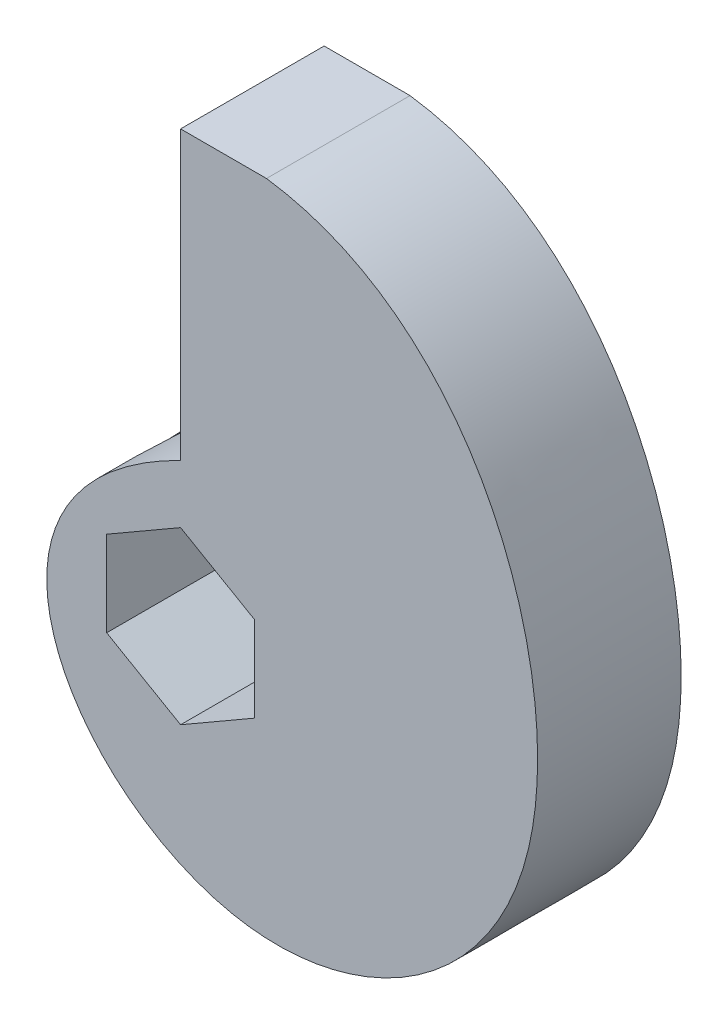
ISO-10303-21;
HEADER;
FILE_DESCRIPTION(('STEP AP214'),'2;1');
FILE_NAME('part.step','',(''),(''),'','','');
FILE_SCHEMA(('AUTOMOTIVE_DESIGN { 1 0 10303 214 1 1 1 1 }'));
ENDSEC;
DATA;
#1=APPLICATION_CONTEXT('core data for automotive mechanical design processes');
#2=APPLICATION_PROTOCOL_DEFINITION('international standard','automotive_design',2000,#1);
#3=PRODUCT_CONTEXT('',#1,'mechanical');
#4=PRODUCT('Part','Part','',(#3));
#5=PRODUCT_RELATED_PRODUCT_CATEGORY('part','',(#4));
#6=PRODUCT_DEFINITION_FORMATION('','',#4);
#7=PRODUCT_DEFINITION_CONTEXT('part definition',#1,'design');
#8=PRODUCT_DEFINITION('design','',#6,#7);
#9=PRODUCT_DEFINITION_SHAPE('','',#8);
#10=(LENGTH_UNIT() NAMED_UNIT(*) SI_UNIT(.MILLI.,.METRE.));
#11=(NAMED_UNIT(*) PLANE_ANGLE_UNIT() SI_UNIT($,.RADIAN.));
#12=(NAMED_UNIT(*) SI_UNIT($,.STERADIAN.) SOLID_ANGLE_UNIT());
#13=UNCERTAINTY_MEASURE_WITH_UNIT(LENGTH_MEASURE(1.E-05),#10,'distance_accuracy_value','');
#14=(GEOMETRIC_REPRESENTATION_CONTEXT(3) GLOBAL_UNCERTAINTY_ASSIGNED_CONTEXT((#13)) GLOBAL_UNIT_ASSIGNED_CONTEXT((#10,
#11,#12)) REPRESENTATION_CONTEXT('',''));
#15=CARTESIAN_POINT('',(0.,0.,0.));
#16=DIRECTION('',(0.,0.,1.));
#17=DIRECTION('',(1.,0.,0.));
#18=AXIS2_PLACEMENT_3D('',#15,#16,#17);
#19=CARTESIAN_POINT('',(0.,0.,12.7));
#20=DIRECTION('',(-1.,0.,0.));
#21=DIRECTION('',(0.,-1.,0.));
#22=AXIS2_PLACEMENT_3D('',#19,#20,#21);
#23=PLANE('',#22);
#24=DIRECTION('',(0.,1.,0.));
#25=VECTOR('',#24,1.);
#26=CARTESIAN_POINT('',(0.,0.,0.));
#27=LINE('',#26,#25);
#28=CARTESIAN_POINT('',(0.,12.7,0.));
#29=VERTEX_POINT('',#28);
#30=CARTESIAN_POINT('',(0.,38.1,0.));
#31=VERTEX_POINT('',#30);
#32=EDGE_CURVE('E153',#29,#31,#27,.T.);
#33=ORIENTED_EDGE('',*,*,#32,.F.);
#34=DIRECTION('',(0.,0.,-1.));
#35=VECTOR('',#34,1.);
#36=CARTESIAN_POINT('',(0.,12.7,12.7));
#37=LINE('',#36,#35);
#38=CARTESIAN_POINT('',(0.,12.7,12.7));
#39=VERTEX_POINT('',#38);
#40=EDGE_CURVE('E11',#39,#29,#37,.T.);
#41=ORIENTED_EDGE('',*,*,#40,.F.);
#42=DIRECTION('',(0.,1.,0.));
#43=VECTOR('',#42,1.);
#44=CARTESIAN_POINT('',(0.,0.,12.7));
#45=LINE('',#44,#43);
#46=CARTESIAN_POINT('',(0.,38.1,12.7));
#47=VERTEX_POINT('',#46);
#48=EDGE_CURVE('E161',#39,#47,#45,.T.);
#49=ORIENTED_EDGE('',*,*,#48,.T.);
#50=DIRECTION('',(0.,0.,-1.));
#51=VECTOR('',#50,1.);
#52=CARTESIAN_POINT('',(0.,38.1,12.7));
#53=LINE('',#52,#51);
#54=EDGE_CURVE('E218',#47,#31,#53,.T.);
#55=ORIENTED_EDGE('',*,*,#54,.T.);
#56=EDGE_LOOP('',(#33,#41,#49,#55));
#57=FACE_BOUND('',#56,.T.);
#58=ADVANCED_FACE('F39',(#57),#23,.T.);
#59=CARTESIAN_POINT('',(0.,38.1,12.7));
#60=CARTESIAN_POINT('',(24.1320907519813,41.1545308493679,12.7));
#61=CARTESIAN_POINT('',(42.8064098762513,-5.77877520103339,12.7));
#62=CARTESIAN_POINT('',(-0.468285520356259,-31.5473871728042,12.7));
#63=CARTESIAN_POINT('',(-21.7730324527285,1.94925782741281,12.7));
#64=CARTESIAN_POINT('',(0.,12.7,12.7));
#65=B_SPLINE_CURVE_WITH_KNOTS('',3,(#59,#60,#61,#62,#63,#64),.UNSPECIFIED.,.F.,.F.,(4,1,1,4),
(0.,0.338030765754855,0.620420862453544,1.),.UNSPECIFIED.);
#66=DIRECTION('',(0.,0.,-1.));
#67=VECTOR('',#66,1.);
#68=SURFACE_OF_LINEAR_EXTRUSION('',#65,#67);
#69=CARTESIAN_POINT('',(0.,38.1,0.));
#70=CARTESIAN_POINT('',(24.1320907519813,41.1545308493679,0.));
#71=CARTESIAN_POINT('',(42.8064098762513,-5.77877520103339,0.));
#72=CARTESIAN_POINT('',(-0.468285520356259,-31.5473871728042,0.));
#73=CARTESIAN_POINT('',(-21.7730324527285,1.94925782741281,0.));
#74=CARTESIAN_POINT('',(0.,12.7,0.));
#75=B_SPLINE_CURVE_WITH_KNOTS('',3,(#69,#70,#71,#72,#73,#74),.UNSPECIFIED.,.F.,.F.,(4,1,1,4),
(0.,0.338030765754855,0.620420862453544,1.),.UNSPECIFIED.);
#76=CARTESIAN_POINT('',(7.59976774176199,38.1,0.));
#77=VERTEX_POINT('',#76);
#78=EDGE_CURVE('E221',#77,#29,#75,.T.);
#79=ORIENTED_EDGE('',*,*,#78,.F.);
#80=DIRECTION('',(0.,0.,-1.));
#81=VECTOR('',#80,1.);
#82=CARTESIAN_POINT('',(7.59976774176199,38.1,12.7));
#83=LINE('',#82,#81);
#84=CARTESIAN_POINT('',(7.59976774176199,38.1,12.7));
#85=VERTEX_POINT('',#84);
#86=EDGE_CURVE('E46',#85,#77,#83,.T.);
#87=ORIENTED_EDGE('',*,*,#86,.F.);
#88=EDGE_CURVE('E164',#85,#39,#65,.T.);
#89=ORIENTED_EDGE('',*,*,#88,.T.);
#90=ORIENTED_EDGE('',*,*,#40,.T.);
#91=EDGE_LOOP('',(#79,#87,#89,#90));
#92=FACE_BOUND('',#91,.T.);
#93=ADVANCED_FACE('F176',(#92),#68,.T.);
#94=CARTESIAN_POINT('',(0.,38.1,12.7));
#95=DIRECTION('',(0.,1.,0.));
#96=DIRECTION('',(0.,0.,1.));
#97=AXIS2_PLACEMENT_3D('',#94,#95,#96);
#98=PLANE('',#97);
#99=DIRECTION('',(1.,0.,0.));
#100=VECTOR('',#99,1.);
#101=CARTESIAN_POINT('',(0.,38.1,0.));
#102=LINE('',#101,#100);
#103=EDGE_CURVE('E165',#31,#77,#102,.T.);
#104=ORIENTED_EDGE('',*,*,#103,.F.);
#105=ORIENTED_EDGE('',*,*,#54,.F.);
#106=DIRECTION('',(1.,0.,0.));
#107=VECTOR('',#106,1.);
#108=CARTESIAN_POINT('',(0.,38.1,12.7));
#109=LINE('',#108,#107);
#110=EDGE_CURVE('E171',#47,#85,#109,.T.);
#111=ORIENTED_EDGE('',*,*,#110,.T.);
#112=ORIENTED_EDGE('',*,*,#86,.T.);
#113=EDGE_LOOP('',(#104,#105,#111,#112));
#114=FACE_BOUND('',#113,.T.);
#115=ADVANCED_FACE('F179',(#114),#98,.T.);
#116=CARTESIAN_POINT('',(0.,0.,12.7));
#117=DIRECTION('',(0.,0.,1.));
#118=DIRECTION('',(1.,0.,0.));
#119=AXIS2_PLACEMENT_3D('',#116,#117,#118);
#120=PLANE('',#119);
#121=DIRECTION('',(0.866025403784438,0.5,0.));
#122=VECTOR('',#121,1.);
#123=CARTESIAN_POINT('',(0.,-7.5523188712695,12.7));
#124=LINE('',#123,#122);
#125=CARTESIAN_POINT('',(0.,-7.5523188712695,12.7));
#126=VERTEX_POINT('',#125);
#127=CARTESIAN_POINT('',(6.5405,-3.77615943563474,12.7));
#128=VERTEX_POINT('',#127);
#129=EDGE_CURVE('E53',#126,#128,#124,.T.);
#130=ORIENTED_EDGE('',*,*,#129,.F.);
#131=DIRECTION('',(0.866025403784439,-0.5,0.));
#132=VECTOR('',#131,1.);
#133=CARTESIAN_POINT('',(-6.5405,-3.77615943563475,12.7));
#134=LINE('',#133,#132);
#135=CARTESIAN_POINT('',(-6.5405,-3.77615943563475,12.7));
#136=VERTEX_POINT('',#135);
#137=EDGE_CURVE('E127',#136,#126,#134,.T.);
#138=ORIENTED_EDGE('',*,*,#137,.F.);
#139=DIRECTION('',(0.,-1.,0.));
#140=VECTOR('',#139,1.);
#141=CARTESIAN_POINT('',(-6.5405,3.77615943563475,12.7));
#142=LINE('',#141,#140);
#143=CARTESIAN_POINT('',(-6.5405,3.77615943563475,12.7));
#144=VERTEX_POINT('',#143);
#145=EDGE_CURVE('E130',#144,#136,#142,.T.);
#146=ORIENTED_EDGE('',*,*,#145,.F.);
#147=DIRECTION('',(-0.866025403784439,-0.5,0.));
#148=VECTOR('',#147,1.);
#149=CARTESIAN_POINT('',(0.,7.5523188712695,12.7));
#150=LINE('',#149,#148);
#151=CARTESIAN_POINT('',(0.,7.5523188712695,12.7));
#152=VERTEX_POINT('',#151);
#153=EDGE_CURVE('E146',#152,#144,#150,.T.);
#154=ORIENTED_EDGE('',*,*,#153,.F.);
#155=DIRECTION('',(-0.866025403784439,0.5,0.));
#156=VECTOR('',#155,1.);
#157=CARTESIAN_POINT('',(6.5405,3.77615943563475,12.7));
#158=LINE('',#157,#156);
#159=CARTESIAN_POINT('',(6.5405,3.77615943563475,12.7));
#160=VERTEX_POINT('',#159);
#161=EDGE_CURVE('E143',#160,#152,#158,.T.);
#162=ORIENTED_EDGE('',*,*,#161,.F.);
#163=DIRECTION('',(0.,1.,0.));
#164=VECTOR('',#163,1.);
#165=CARTESIAN_POINT('',(6.5405,-3.77615943563474,12.7));
#166=LINE('',#165,#164);
#167=EDGE_CURVE('E141',#128,#160,#166,.T.);
#168=ORIENTED_EDGE('',*,*,#167,.F.);
#169=EDGE_LOOP('',(#130,#138,#146,#154,#162,#168));
#170=FACE_BOUND('',#169,.T.);
#171=ORIENTED_EDGE('',*,*,#48,.F.);
#172=ORIENTED_EDGE('',*,*,#88,.F.);
#173=ORIENTED_EDGE('',*,*,#110,.F.);
#174=EDGE_LOOP('',(#171,#172,#173));
#175=FACE_BOUND('',#174,.T.);
#176=ADVANCED_FACE('F183',(#170,#175),#120,.T.);
#177=CARTESIAN_POINT('',(0.,0.,0.));
#178=DIRECTION('',(0.,0.,1.));
#179=DIRECTION('',(1.,0.,0.));
#180=AXIS2_PLACEMENT_3D('',#177,#178,#179);
#181=PLANE('',#180);
#182=DIRECTION('',(0.866025403784439,-0.5,0.));
#183=VECTOR('',#182,1.);
#184=CARTESIAN_POINT('',(-6.5405,-3.77615943563475,0.));
#185=LINE('',#184,#183);
#186=CARTESIAN_POINT('',(-6.5405,-3.77615943563475,0.));
#187=VERTEX_POINT('',#186);
#188=CARTESIAN_POINT('',(0.,-7.5523188712695,0.));
#189=VERTEX_POINT('',#188);
#190=EDGE_CURVE('E116',#187,#189,#185,.T.);
#191=ORIENTED_EDGE('',*,*,#190,.T.);
#192=DIRECTION('',(0.866025403784438,0.5,0.));
#193=VECTOR('',#192,1.);
#194=CARTESIAN_POINT('',(0.,-7.5523188712695,0.));
#195=LINE('',#194,#193);
#196=CARTESIAN_POINT('',(6.5405,-3.77615943563474,0.));
#197=VERTEX_POINT('',#196);
#198=EDGE_CURVE('E110',#189,#197,#195,.T.);
#199=ORIENTED_EDGE('',*,*,#198,.T.);
#200=DIRECTION('',(0.,1.,0.));
#201=VECTOR('',#200,1.);
#202=CARTESIAN_POINT('',(6.5405,-3.77615943563474,0.));
#203=LINE('',#202,#201);
#204=CARTESIAN_POINT('',(6.5405,3.77615943563475,0.));
#205=VERTEX_POINT('',#204);
#206=EDGE_CURVE('E119',#197,#205,#203,.T.);
#207=ORIENTED_EDGE('',*,*,#206,.T.);
#208=DIRECTION('',(-0.866025403784439,0.5,0.));
#209=VECTOR('',#208,1.);
#210=CARTESIAN_POINT('',(6.5405,3.77615943563475,0.));
#211=LINE('',#210,#209);
#212=CARTESIAN_POINT('',(0.,7.5523188712695,0.));
#213=VERTEX_POINT('',#212);
#214=EDGE_CURVE('E61',#205,#213,#211,.T.);
#215=ORIENTED_EDGE('',*,*,#214,.T.);
#216=DIRECTION('',(-0.866025403784439,-0.5,0.));
#217=VECTOR('',#216,1.);
#218=CARTESIAN_POINT('',(0.,7.5523188712695,0.));
#219=LINE('',#218,#217);
#220=CARTESIAN_POINT('',(-6.5405,3.77615943563475,0.));
#221=VERTEX_POINT('',#220);
#222=EDGE_CURVE('E134',#213,#221,#219,.T.);
#223=ORIENTED_EDGE('',*,*,#222,.T.);
#224=DIRECTION('',(0.,-1.,0.));
#225=VECTOR('',#224,1.);
#226=CARTESIAN_POINT('',(-6.5405,3.77615943563475,0.));
#227=LINE('',#226,#225);
#228=EDGE_CURVE('E137',#221,#187,#227,.T.);
#229=ORIENTED_EDGE('',*,*,#228,.T.);
#230=EDGE_LOOP('',(#191,#199,#207,#215,#223,#229));
#231=FACE_BOUND('',#230,.T.);
#232=ORIENTED_EDGE('',*,*,#32,.T.);
#233=ORIENTED_EDGE('',*,*,#103,.T.);
#234=ORIENTED_EDGE('',*,*,#78,.T.);
#235=EDGE_LOOP('',(#232,#233,#234));
#236=FACE_BOUND('',#235,.T.);
#237=ADVANCED_FACE('F123',(#231,#236),#181,.F.);
#238=CARTESIAN_POINT('',(0.,-7.5523188712695,0.));
#239=DIRECTION('',(0.5,-0.866025403784438,0.));
#240=DIRECTION('',(0.866025403784438,0.5,0.));
#241=AXIS2_PLACEMENT_3D('',#238,#239,#240);
#242=PLANE('',#241);
#243=ORIENTED_EDGE('',*,*,#129,.T.);
#244=DIRECTION('',(0.,0.,1.));
#245=VECTOR('',#244,1.);
#246=CARTESIAN_POINT('',(6.5405,-3.77615943563474,0.));
#247=LINE('',#246,#245);
#248=EDGE_CURVE('E106',#197,#128,#247,.T.);
#249=ORIENTED_EDGE('',*,*,#248,.F.);
#250=ORIENTED_EDGE('',*,*,#198,.F.);
#251=DIRECTION('',(0.,0.,1.));
#252=VECTOR('',#251,1.);
#253=CARTESIAN_POINT('',(0.,-7.5523188712695,0.));
#254=LINE('',#253,#252);
#255=EDGE_CURVE('E151',#189,#126,#254,.T.);
#256=ORIENTED_EDGE('',*,*,#255,.T.);
#257=EDGE_LOOP('',(#243,#249,#250,#256));
#258=FACE_BOUND('',#257,.T.);
#259=ADVANCED_FACE('F108',(#258),#242,.F.);
#260=CARTESIAN_POINT('',(-6.5405,-3.77615943563475,0.));
#261=DIRECTION('',(-0.5,-0.866025403784438,0.));
#262=DIRECTION('',(0.866025403784439,-0.5,0.));
#263=AXIS2_PLACEMENT_3D('',#260,#261,#262);
#264=PLANE('',#263);
#265=ORIENTED_EDGE('',*,*,#137,.T.);
#266=ORIENTED_EDGE('',*,*,#255,.F.);
#267=ORIENTED_EDGE('',*,*,#190,.F.);
#268=DIRECTION('',(0.,0.,1.));
#269=VECTOR('',#268,1.);
#270=CARTESIAN_POINT('',(-6.5405,-3.77615943563475,0.));
#271=LINE('',#270,#269);
#272=EDGE_CURVE('E154',#187,#136,#271,.T.);
#273=ORIENTED_EDGE('',*,*,#272,.T.);
#274=EDGE_LOOP('',(#265,#266,#267,#273));
#275=FACE_BOUND('',#274,.T.);
#276=ADVANCED_FACE('F192',(#275),#264,.F.);
#277=CARTESIAN_POINT('',(-6.5405,3.77615943563475,0.));
#278=DIRECTION('',(-1.,0.,0.));
#279=DIRECTION('',(0.,-1.,0.));
#280=AXIS2_PLACEMENT_3D('',#277,#278,#279);
#281=PLANE('',#280);
#282=ORIENTED_EDGE('',*,*,#145,.T.);
#283=ORIENTED_EDGE('',*,*,#272,.F.);
#284=ORIENTED_EDGE('',*,*,#228,.F.);
#285=DIRECTION('',(0.,0.,1.));
#286=VECTOR('',#285,1.);
#287=CARTESIAN_POINT('',(-6.5405,3.77615943563475,0.));
#288=LINE('',#287,#286);
#289=EDGE_CURVE('E156',#221,#144,#288,.T.);
#290=ORIENTED_EDGE('',*,*,#289,.T.);
#291=EDGE_LOOP('',(#282,#283,#284,#290));
#292=FACE_BOUND('',#291,.T.);
#293=ADVANCED_FACE('F201',(#292),#281,.F.);
#294=CARTESIAN_POINT('',(0.,7.5523188712695,0.));
#295=DIRECTION('',(-0.5,0.866025403784439,0.));
#296=DIRECTION('',(-0.866025403784439,-0.5,0.));
#297=AXIS2_PLACEMENT_3D('',#294,#295,#296);
#298=PLANE('',#297);
#299=ORIENTED_EDGE('',*,*,#153,.T.);
#300=ORIENTED_EDGE('',*,*,#289,.F.);
#301=ORIENTED_EDGE('',*,*,#222,.F.);
#302=DIRECTION('',(0.,0.,1.));
#303=VECTOR('',#302,1.);
#304=CARTESIAN_POINT('',(0.,7.5523188712695,0.));
#305=LINE('',#304,#303);
#306=EDGE_CURVE('E158',#213,#152,#305,.T.);
#307=ORIENTED_EDGE('',*,*,#306,.T.);
#308=EDGE_LOOP('',(#299,#300,#301,#307));
#309=FACE_BOUND('',#308,.T.);
#310=ADVANCED_FACE('F198',(#309),#298,.F.);
#311=CARTESIAN_POINT('',(6.5405,3.77615943563475,0.));
#312=DIRECTION('',(0.5,0.866025403784439,0.));
#313=DIRECTION('',(-0.866025403784439,0.5,0.));
#314=AXIS2_PLACEMENT_3D('',#311,#312,#313);
#315=PLANE('',#314);
#316=ORIENTED_EDGE('',*,*,#161,.T.);
#317=ORIENTED_EDGE('',*,*,#306,.F.);
#318=ORIENTED_EDGE('',*,*,#214,.F.);
#319=DIRECTION('',(0.,0.,1.));
#320=VECTOR('',#319,1.);
#321=CARTESIAN_POINT('',(6.5405,3.77615943563475,0.));
#322=LINE('',#321,#320);
#323=EDGE_CURVE('E115',#205,#160,#322,.T.);
#324=ORIENTED_EDGE('',*,*,#323,.T.);
#325=EDGE_LOOP('',(#316,#317,#318,#324));
#326=FACE_BOUND('',#325,.T.);
#327=ADVANCED_FACE('F195',(#326),#315,.F.);
#328=CARTESIAN_POINT('',(6.5405,-3.77615943563474,0.));
#329=DIRECTION('',(1.,0.,0.));
#330=DIRECTION('',(0.,0.,-1.));
#331=AXIS2_PLACEMENT_3D('',#328,#329,#330);
#332=PLANE('',#331);
#333=ORIENTED_EDGE('',*,*,#167,.T.);
#334=ORIENTED_EDGE('',*,*,#323,.F.);
#335=ORIENTED_EDGE('',*,*,#206,.F.);
#336=ORIENTED_EDGE('',*,*,#248,.T.);
#337=EDGE_LOOP('',(#333,#334,#335,#336));
#338=FACE_BOUND('',#337,.T.);
#339=ADVANCED_FACE('F120',(#338),#332,.F.);
#340=CLOSED_SHELL('',(#58,#93,#115,#176,#237,#259,#276,#293,#310,#327,#339));
#341=MANIFOLD_SOLID_BREP('B2',#340);
#342=ADVANCED_BREP_SHAPE_REPRESENTATION('',(#18,#341),#14);
#343=SHAPE_DEFINITION_REPRESENTATION(#9,#342);
ENDSEC;
END-ISO-10303-21;
